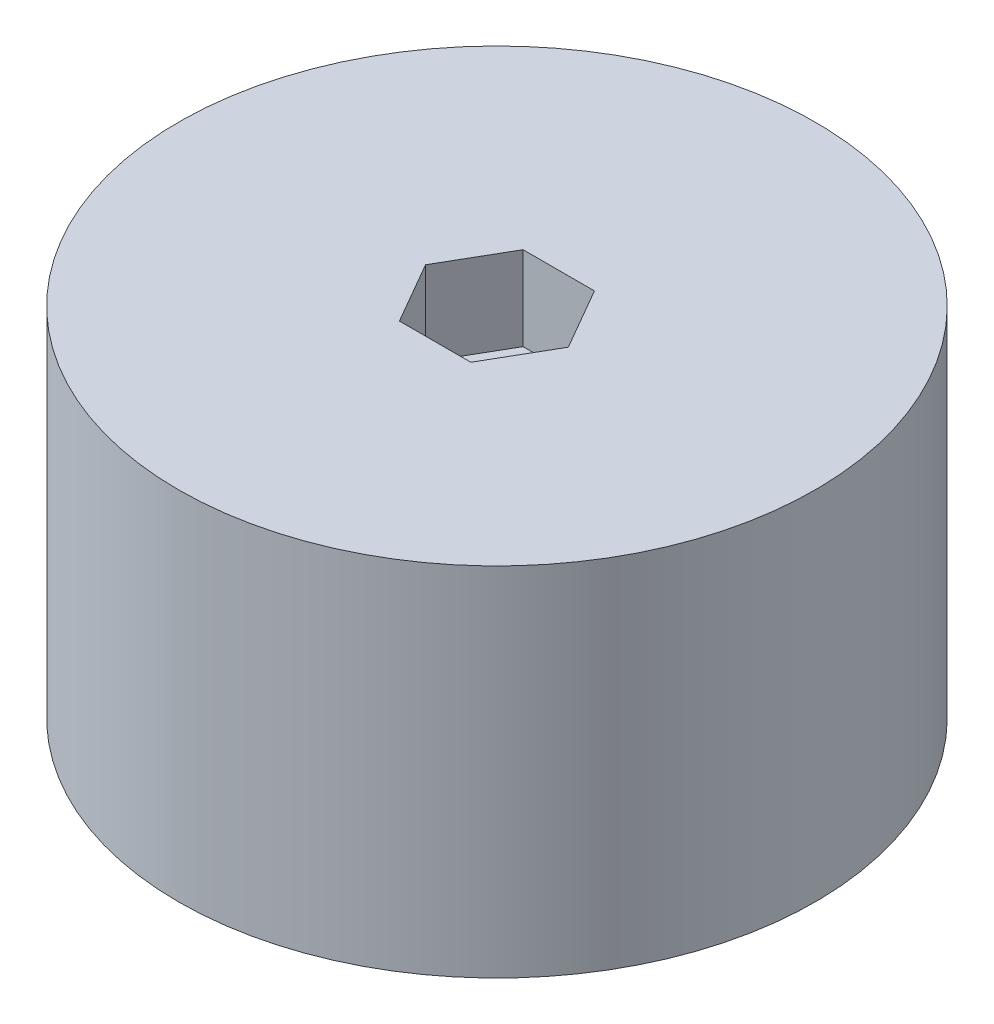
ISO-10303-21;
HEADER;
FILE_DESCRIPTION(('STEP AP214'),'2;1');
FILE_NAME('part.step','',(''),(''),'','','');
FILE_SCHEMA(('AUTOMOTIVE_DESIGN { 1 0 10303 214 1 1 1 1 }'));
ENDSEC;
DATA;
#1=APPLICATION_CONTEXT('core data for automotive mechanical design processes');
#2=APPLICATION_PROTOCOL_DEFINITION('international standard','automotive_design',2000,#1);
#3=PRODUCT_CONTEXT('',#1,'mechanical');
#4=PRODUCT('Part','Part','',(#3));
#5=PRODUCT_RELATED_PRODUCT_CATEGORY('part','',(#4));
#6=PRODUCT_DEFINITION_FORMATION('','',#4);
#7=PRODUCT_DEFINITION_CONTEXT('part definition',#1,'design');
#8=PRODUCT_DEFINITION('design','',#6,#7);
#9=PRODUCT_DEFINITION_SHAPE('','',#8);
#10=(LENGTH_UNIT() NAMED_UNIT(*) SI_UNIT(.MILLI.,.METRE.));
#11=(NAMED_UNIT(*) PLANE_ANGLE_UNIT() SI_UNIT($,.RADIAN.));
#12=(NAMED_UNIT(*) SI_UNIT($,.STERADIAN.) SOLID_ANGLE_UNIT());
#13=UNCERTAINTY_MEASURE_WITH_UNIT(LENGTH_MEASURE(1.E-05),#10,'distance_accuracy_value','');
#14=(GEOMETRIC_REPRESENTATION_CONTEXT(3) GLOBAL_UNCERTAINTY_ASSIGNED_CONTEXT((#13)) GLOBAL_UNIT_ASSIGNED_CONTEXT((#10,
#11,#12)) REPRESENTATION_CONTEXT('',''));
#15=CARTESIAN_POINT('',(0.,0.,0.));
#16=DIRECTION('',(0.,0.,1.));
#17=DIRECTION('',(1.,0.,0.));
#18=AXIS2_PLACEMENT_3D('',#15,#16,#17);
#19=CARTESIAN_POINT('',(0.,25.5,0.));
#20=DIRECTION('',(0.,-1.,0.));
#21=DIRECTION('',(0.,0.,-1.));
#22=AXIS2_PLACEMENT_3D('',#19,#20,#21);
#23=CYLINDRICAL_SURFACE('',#22,3.);
#24=CARTESIAN_POINT('',(0.,0.,0.));
#25=DIRECTION('',(0.,1.,0.));
#26=DIRECTION('',(0.,0.,1.));
#27=AXIS2_PLACEMENT_3D('',#24,#25,#26);
#28=CIRCLE('',#27,3.);
#29=CARTESIAN_POINT('',(0.,0.,3.));
#30=VERTEX_POINT('',#29);
#31=EDGE_CURVE('E165',#30,#30,#28,.T.);
#32=ORIENTED_EDGE('',*,*,#31,.F.);
#33=EDGE_LOOP('',(#32));
#34=FACE_BOUND('',#33,.T.);
#35=CARTESIAN_POINT('',(0.,19.5,0.));
#36=DIRECTION('',(0.,1.,0.));
#37=DIRECTION('',(0.,0.,1.));
#38=AXIS2_PLACEMENT_3D('',#35,#36,#37);
#39=CIRCLE('',#38,3.);
#40=CARTESIAN_POINT('',(0.,19.5,3.));
#41=VERTEX_POINT('',#40);
#42=EDGE_CURVE('E43',#41,#41,#39,.T.);
#43=ORIENTED_EDGE('',*,*,#42,.T.);
#44=EDGE_LOOP('',(#43));
#45=FACE_BOUND('',#44,.T.);
#46=ADVANCED_FACE('F39',(#34,#45),#23,.F.);
#47=CARTESIAN_POINT('',(0.,25.5,0.));
#48=DIRECTION('',(0.,1.,0.));
#49=DIRECTION('',(0.,0.,1.));
#50=AXIS2_PLACEMENT_3D('',#47,#48,#49);
#51=PLANE('',#50);
#52=DIRECTION('',(0.5,0.,-0.866025403784439));
#53=VECTOR('',#52,1.);
#54=CARTESIAN_POINT('',(2.55,25.5,4.41672955930064));
#55=LINE('',#54,#53);
#56=CARTESIAN_POINT('',(2.55,25.5,4.41672955930064));
#57=VERTEX_POINT('',#56);
#58=CARTESIAN_POINT('',(5.1,25.5,0.));
#59=VERTEX_POINT('',#58);
#60=EDGE_CURVE('E57',#57,#59,#55,.T.);
#61=ORIENTED_EDGE('',*,*,#60,.F.);
#62=DIRECTION('',(1.,0.,0.));
#63=VECTOR('',#62,1.);
#64=CARTESIAN_POINT('',(-2.55,25.5,4.41672955930064));
#65=LINE('',#64,#63);
#66=CARTESIAN_POINT('',(-2.55,25.5,4.41672955930064));
#67=VERTEX_POINT('',#66);
#68=EDGE_CURVE('E150',#67,#57,#65,.T.);
#69=ORIENTED_EDGE('',*,*,#68,.F.);
#70=DIRECTION('',(0.5,0.,0.866025403784439));
#71=VECTOR('',#70,1.);
#72=CARTESIAN_POINT('',(-5.1,25.5,0.));
#73=LINE('',#72,#71);
#74=CARTESIAN_POINT('',(-5.1,25.5,0.));
#75=VERTEX_POINT('',#74);
#76=EDGE_CURVE('E147',#75,#67,#73,.T.);
#77=ORIENTED_EDGE('',*,*,#76,.F.);
#78=DIRECTION('',(-0.5,0.,0.866025403784439));
#79=VECTOR('',#78,1.);
#80=CARTESIAN_POINT('',(-2.55,25.5,-4.41672955930064));
#81=LINE('',#80,#79);
#82=CARTESIAN_POINT('',(-2.55,25.5,-4.41672955930064));
#83=VERTEX_POINT('',#82);
#84=EDGE_CURVE('E105',#83,#75,#81,.T.);
#85=ORIENTED_EDGE('',*,*,#84,.F.);
#86=DIRECTION('',(-1.,0.,0.));
#87=VECTOR('',#86,1.);
#88=CARTESIAN_POINT('',(2.55,25.5,-4.41672955930064));
#89=LINE('',#88,#87);
#90=CARTESIAN_POINT('',(2.55,25.5,-4.41672955930064));
#91=VERTEX_POINT('',#90);
#92=EDGE_CURVE('E141',#91,#83,#89,.T.);
#93=ORIENTED_EDGE('',*,*,#92,.F.);
#94=DIRECTION('',(-0.5,0.,-0.866025403784439));
#95=VECTOR('',#94,1.);
#96=CARTESIAN_POINT('',(5.1,25.5,0.));
#97=LINE('',#96,#95);
#98=EDGE_CURVE('E137',#59,#91,#97,.T.);
#99=ORIENTED_EDGE('',*,*,#98,.F.);
#100=EDGE_LOOP('',(#61,#69,#77,#85,#93,#99));
#101=FACE_BOUND('',#100,.T.);
#102=CARTESIAN_POINT('',(0.,25.5,0.));
#103=DIRECTION('',(0.,1.,0.));
#104=DIRECTION('',(0.,0.,1.));
#105=AXIS2_PLACEMENT_3D('',#102,#103,#104);
#106=CIRCLE('',#105,22.75);
#107=CARTESIAN_POINT('',(0.,25.5,22.75));
#108=VERTEX_POINT('',#107);
#109=EDGE_CURVE('E11',#108,#108,#106,.T.);
#110=ORIENTED_EDGE('',*,*,#109,.T.);
#111=EDGE_LOOP('',(#110));
#112=FACE_BOUND('',#111,.T.);
#113=ADVANCED_FACE('F176',(#101,#112),#51,.T.);
#114=CARTESIAN_POINT('',(0.,0.,0.));
#115=DIRECTION('',(0.,1.,0.));
#116=DIRECTION('',(0.,0.,1.));
#117=AXIS2_PLACEMENT_3D('',#114,#115,#116);
#118=PLANE('',#117);
#119=CARTESIAN_POINT('',(0.,0.,0.));
#120=DIRECTION('',(0.,1.,0.));
#121=DIRECTION('',(0.,0.,1.));
#122=AXIS2_PLACEMENT_3D('',#119,#120,#121);
#123=CIRCLE('',#122,22.75);
#124=CARTESIAN_POINT('',(0.,0.,22.75));
#125=VERTEX_POINT('',#124);
#126=EDGE_CURVE('E49',#125,#125,#123,.T.);
#127=ORIENTED_EDGE('',*,*,#126,.F.);
#128=EDGE_LOOP('',(#127));
#129=FACE_BOUND('',#128,.T.);
#130=ORIENTED_EDGE('',*,*,#31,.T.);
#131=EDGE_LOOP('',(#130));
#132=FACE_BOUND('',#131,.T.);
#133=ADVANCED_FACE('F173',(#129,#132),#118,.F.);
#134=CARTESIAN_POINT('',(0.,25.5,0.));
#135=DIRECTION('',(0.,-1.,0.));
#136=DIRECTION('',(0.,0.,-1.));
#137=AXIS2_PLACEMENT_3D('',#134,#135,#136);
#138=CYLINDRICAL_SURFACE('',#137,22.75);
#139=ORIENTED_EDGE('',*,*,#109,.F.);
#140=EDGE_LOOP('',(#139));
#141=FACE_BOUND('',#140,.T.);
#142=ORIENTED_EDGE('',*,*,#126,.T.);
#143=EDGE_LOOP('',(#142));
#144=FACE_BOUND('',#143,.T.);
#145=ADVANCED_FACE('F41',(#141,#144),#138,.T.);
#146=CARTESIAN_POINT('',(2.55,19.5,4.41672955930064));
#147=DIRECTION('',(0.866025403784439,0.,0.5));
#148=DIRECTION('',(0.5,0.,-0.866025403784439));
#149=AXIS2_PLACEMENT_3D('',#146,#147,#148);
#150=PLANE('',#149);
#151=ORIENTED_EDGE('',*,*,#60,.T.);
#152=DIRECTION('',(0.,1.,0.));
#153=VECTOR('',#152,1.);
#154=CARTESIAN_POINT('',(5.1,19.5,0.));
#155=LINE('',#154,#153);
#156=CARTESIAN_POINT('',(5.1,19.5,0.));
#157=VERTEX_POINT('',#156);
#158=EDGE_CURVE('E87',#157,#59,#155,.T.);
#159=ORIENTED_EDGE('',*,*,#158,.F.);
#160=DIRECTION('',(0.5,0.,-0.866025403784439));
#161=VECTOR('',#160,1.);
#162=CARTESIAN_POINT('',(2.55,19.5,4.41672955930064));
#163=LINE('',#162,#161);
#164=CARTESIAN_POINT('',(2.55,19.5,4.41672955930064));
#165=VERTEX_POINT('',#164);
#166=EDGE_CURVE('E153',#165,#157,#163,.T.);
#167=ORIENTED_EDGE('',*,*,#166,.F.);
#168=DIRECTION('',(0.,1.,0.));
#169=VECTOR('',#168,1.);
#170=CARTESIAN_POINT('',(2.55,19.5,4.41672955930064));
#171=LINE('',#170,#169);
#172=EDGE_CURVE('E65',#165,#57,#171,.T.);
#173=ORIENTED_EDGE('',*,*,#172,.T.);
#174=EDGE_LOOP('',(#151,#159,#167,#173));
#175=FACE_BOUND('',#174,.T.);
#176=ADVANCED_FACE('F199',(#175),#150,.F.);
#177=CARTESIAN_POINT('',(-2.55,19.5,4.41672955930064));
#178=DIRECTION('',(0.,0.,1.));
#179=DIRECTION('',(1.,0.,0.));
#180=AXIS2_PLACEMENT_3D('',#177,#178,#179);
#181=PLANE('',#180);
#182=ORIENTED_EDGE('',*,*,#68,.T.);
#183=ORIENTED_EDGE('',*,*,#172,.F.);
#184=DIRECTION('',(1.,0.,0.));
#185=VECTOR('',#184,1.);
#186=CARTESIAN_POINT('',(-2.55,19.5,4.41672955930064));
#187=LINE('',#186,#185);
#188=CARTESIAN_POINT('',(-2.55,19.5,4.41672955930064));
#189=VERTEX_POINT('',#188);
#190=EDGE_CURVE('E119',#189,#165,#187,.T.);
#191=ORIENTED_EDGE('',*,*,#190,.F.);
#192=DIRECTION('',(0.,1.,0.));
#193=VECTOR('',#192,1.);
#194=CARTESIAN_POINT('',(-2.55,19.5,4.41672955930064));
#195=LINE('',#194,#193);
#196=EDGE_CURVE('E110',#189,#67,#195,.T.);
#197=ORIENTED_EDGE('',*,*,#196,.T.);
#198=EDGE_LOOP('',(#182,#183,#191,#197));
#199=FACE_BOUND('',#198,.T.);
#200=ADVANCED_FACE('F196',(#199),#181,.F.);
#201=CARTESIAN_POINT('',(-5.1,19.5,0.));
#202=DIRECTION('',(-0.866025403784439,0.,0.5));
#203=DIRECTION('',(0.5,0.,0.866025403784439));
#204=AXIS2_PLACEMENT_3D('',#201,#202,#203);
#205=PLANE('',#204);
#206=ORIENTED_EDGE('',*,*,#76,.T.);
#207=ORIENTED_EDGE('',*,*,#196,.F.);
#208=DIRECTION('',(0.5,0.,0.866025403784439));
#209=VECTOR('',#208,1.);
#210=CARTESIAN_POINT('',(-5.1,19.5,0.));
#211=LINE('',#210,#209);
#212=CARTESIAN_POINT('',(-5.1,19.5,0.));
#213=VERTEX_POINT('',#212);
#214=EDGE_CURVE('E114',#213,#189,#211,.T.);
#215=ORIENTED_EDGE('',*,*,#214,.F.);
#216=DIRECTION('',(0.,1.,0.));
#217=VECTOR('',#216,1.);
#218=CARTESIAN_POINT('',(-5.1,19.5,0.));
#219=LINE('',#218,#217);
#220=EDGE_CURVE('E98',#213,#75,#219,.T.);
#221=ORIENTED_EDGE('',*,*,#220,.T.);
#222=EDGE_LOOP('',(#206,#207,#215,#221));
#223=FACE_BOUND('',#222,.T.);
#224=ADVANCED_FACE('F115',(#223),#205,.F.);
#225=CARTESIAN_POINT('',(-2.55,19.5,-4.41672955930064));
#226=DIRECTION('',(-0.866025403784439,0.,-0.5));
#227=DIRECTION('',(-0.5,0.,0.866025403784439));
#228=AXIS2_PLACEMENT_3D('',#225,#226,#227);
#229=PLANE('',#228);
#230=ORIENTED_EDGE('',*,*,#84,.T.);
#231=ORIENTED_EDGE('',*,*,#220,.F.);
#232=DIRECTION('',(-0.5,0.,0.866025403784439));
#233=VECTOR('',#232,1.);
#234=CARTESIAN_POINT('',(-2.55,19.5,-4.41672955930064));
#235=LINE('',#234,#233);
#236=CARTESIAN_POINT('',(-2.55,19.5,-4.41672955930064));
#237=VERTEX_POINT('',#236);
#238=EDGE_CURVE('E102',#237,#213,#235,.T.);
#239=ORIENTED_EDGE('',*,*,#238,.F.);
#240=DIRECTION('',(0.,1.,0.));
#241=VECTOR('',#240,1.);
#242=CARTESIAN_POINT('',(-2.55,19.5,-4.41672955930064));
#243=LINE('',#242,#241);
#244=EDGE_CURVE('E111',#237,#83,#243,.T.);
#245=ORIENTED_EDGE('',*,*,#244,.T.);
#246=EDGE_LOOP('',(#230,#231,#239,#245));
#247=FACE_BOUND('',#246,.T.);
#248=ADVANCED_FACE('F100',(#247),#229,.F.);
#249=CARTESIAN_POINT('',(2.55,19.5,-4.41672955930064));
#250=DIRECTION('',(0.,0.,-1.));
#251=DIRECTION('',(-1.,0.,0.));
#252=AXIS2_PLACEMENT_3D('',#249,#250,#251);
#253=PLANE('',#252);
#254=ORIENTED_EDGE('',*,*,#92,.T.);
#255=ORIENTED_EDGE('',*,*,#244,.F.);
#256=DIRECTION('',(-1.,0.,0.));
#257=VECTOR('',#256,1.);
#258=CARTESIAN_POINT('',(2.55,19.5,-4.41672955930064));
#259=LINE('',#258,#257);
#260=CARTESIAN_POINT('',(2.55,19.5,-4.41672955930064));
#261=VERTEX_POINT('',#260);
#262=EDGE_CURVE('E125',#261,#237,#259,.T.);
#263=ORIENTED_EDGE('',*,*,#262,.F.);
#264=DIRECTION('',(0.,1.,0.));
#265=VECTOR('',#264,1.);
#266=CARTESIAN_POINT('',(2.55,19.5,-4.41672955930064));
#267=LINE('',#266,#265);
#268=EDGE_CURVE('E160',#261,#91,#267,.T.);
#269=ORIENTED_EDGE('',*,*,#268,.T.);
#270=EDGE_LOOP('',(#254,#255,#263,#269));
#271=FACE_BOUND('',#270,.T.);
#272=ADVANCED_FACE('F192',(#271),#253,.F.);
#273=CARTESIAN_POINT('',(5.1,19.5,0.));
#274=DIRECTION('',(0.866025403784439,0.,-0.5));
#275=DIRECTION('',(-0.5,0.,-0.866025403784439));
#276=AXIS2_PLACEMENT_3D('',#273,#274,#275);
#277=PLANE('',#276);
#278=ORIENTED_EDGE('',*,*,#98,.T.);
#279=ORIENTED_EDGE('',*,*,#268,.F.);
#280=DIRECTION('',(-0.5,0.,-0.866025403784439));
#281=VECTOR('',#280,1.);
#282=CARTESIAN_POINT('',(5.1,19.5,0.));
#283=LINE('',#282,#281);
#284=EDGE_CURVE('E129',#157,#261,#283,.T.);
#285=ORIENTED_EDGE('',*,*,#284,.F.);
#286=ORIENTED_EDGE('',*,*,#158,.T.);
#287=EDGE_LOOP('',(#278,#279,#285,#286));
#288=FACE_BOUND('',#287,.T.);
#289=ADVANCED_FACE('F187',(#288),#277,.F.);
#290=CARTESIAN_POINT('',(0.,19.5,0.));
#291=DIRECTION('',(0.,1.,0.));
#292=DIRECTION('',(0.,0.,1.));
#293=AXIS2_PLACEMENT_3D('',#290,#291,#292);
#294=PLANE('',#293);
#295=ORIENTED_EDGE('',*,*,#42,.F.);
#296=EDGE_LOOP('',(#295));
#297=FACE_BOUND('',#296,.T.);
#298=ORIENTED_EDGE('',*,*,#166,.T.);
#299=ORIENTED_EDGE('',*,*,#284,.T.);
#300=ORIENTED_EDGE('',*,*,#262,.T.);
#301=ORIENTED_EDGE('',*,*,#238,.T.);
#302=ORIENTED_EDGE('',*,*,#214,.T.);
#303=ORIENTED_EDGE('',*,*,#190,.T.);
#304=EDGE_LOOP('',(#298,#299,#300,#301,#302,#303));
#305=FACE_BOUND('',#304,.T.);
#306=ADVANCED_FACE('F122',(#297,#305),#294,.T.);
#307=CLOSED_SHELL('',(#46,#113,#133,#145,#176,#200,#224,#248,#272,#289,#306));
#308=MANIFOLD_SOLID_BREP('B2',#307);
#309=ADVANCED_BREP_SHAPE_REPRESENTATION('',(#18,#308),#14);
#310=SHAPE_DEFINITION_REPRESENTATION(#9,#309);
ENDSEC;
END-ISO-10303-21;
